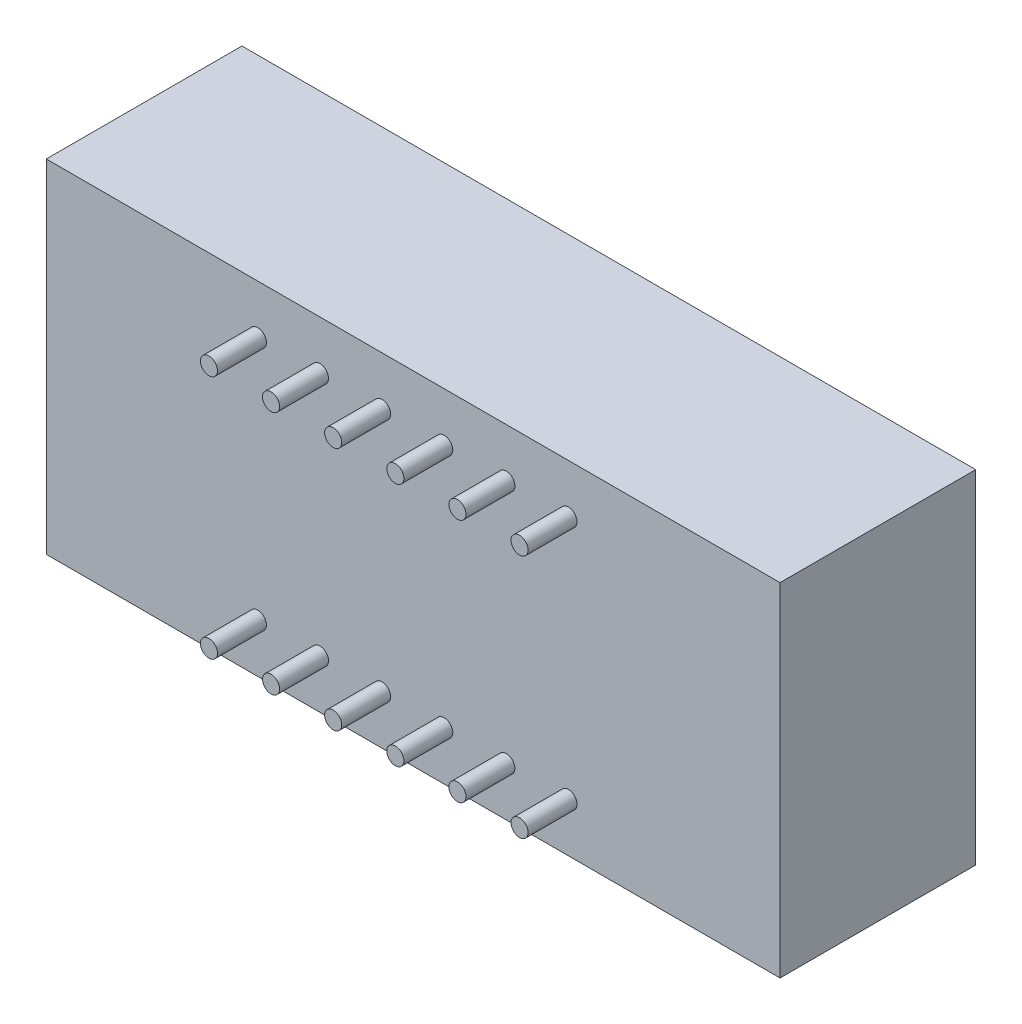
ISO-10303-21;
HEADER;
FILE_DESCRIPTION(('STEP AP214'),'2;1');
FILE_NAME('part.step','',(''),(''),'','','');
FILE_SCHEMA(('AUTOMOTIVE_DESIGN { 1 0 10303 214 1 1 1 1 }'));
ENDSEC;
DATA;
#1=APPLICATION_CONTEXT('core data for automotive mechanical design processes');
#2=APPLICATION_PROTOCOL_DEFINITION('international standard','automotive_design',2000,#1);
#3=PRODUCT_CONTEXT('',#1,'mechanical');
#4=PRODUCT('Part','Part','',(#3));
#5=PRODUCT_RELATED_PRODUCT_CATEGORY('part','',(#4));
#6=PRODUCT_DEFINITION_FORMATION('','',#4);
#7=PRODUCT_DEFINITION_CONTEXT('part definition',#1,'design');
#8=PRODUCT_DEFINITION('design','',#6,#7);
#9=PRODUCT_DEFINITION_SHAPE('','',#8);
#10=(LENGTH_UNIT() NAMED_UNIT(*) SI_UNIT(.MILLI.,.METRE.));
#11=(NAMED_UNIT(*) PLANE_ANGLE_UNIT() SI_UNIT($,.RADIAN.));
#12=(NAMED_UNIT(*) SI_UNIT($,.STERADIAN.) SOLID_ANGLE_UNIT());
#13=UNCERTAINTY_MEASURE_WITH_UNIT(LENGTH_MEASURE(1.E-05),#10,'distance_accuracy_value','');
#14=(GEOMETRIC_REPRESENTATION_CONTEXT(3) GLOBAL_UNCERTAINTY_ASSIGNED_CONTEXT((#13)) GLOBAL_UNIT_ASSIGNED_CONTEXT((#10,
#11,#12)) REPRESENTATION_CONTEXT('',''));
#15=CARTESIAN_POINT('',(0.,0.,0.));
#16=DIRECTION('',(0.,0.,1.));
#17=DIRECTION('',(1.,0.,0.));
#18=AXIS2_PLACEMENT_3D('',#15,#16,#17);
#19=CARTESIAN_POINT('',(0.,14.,8.));
#20=DIRECTION('',(0.,0.,-1.));
#21=DIRECTION('',(-1.,0.,0.));
#22=AXIS2_PLACEMENT_3D('',#19,#20,#21);
#23=PLANE('',#22);
#24=CARTESIAN_POINT('',(18.8100000000001,2.,8.));
#25=DIRECTION('',(0.,0.,-1.));
#26=DIRECTION('',(-1.,0.,0.));
#27=AXIS2_PLACEMENT_3D('',#24,#25,#26);
#28=CIRCLE('',#27,0.350000000000001);
#29=CARTESIAN_POINT('',(18.4600000000001,2.,8.));
#30=VERTEX_POINT('',#29);
#31=EDGE_CURVE('E51',#30,#30,#28,.F.);
#32=ORIENTED_EDGE('',*,*,#31,.F.);
#33=EDGE_LOOP('',(#32));
#34=FACE_BOUND('',#33,.T.);
#35=CARTESIAN_POINT('',(13.7300000000001,2.,8.));
#36=DIRECTION('',(0.,0.,-1.));
#37=DIRECTION('',(-1.,0.,0.));
#38=AXIS2_PLACEMENT_3D('',#35,#36,#37);
#39=CIRCLE('',#38,0.349999999999999);
#40=CARTESIAN_POINT('',(13.3800000000001,2.,8.));
#41=VERTEX_POINT('',#40);
#42=EDGE_CURVE('E165',#41,#41,#39,.F.);
#43=ORIENTED_EDGE('',*,*,#42,.F.);
#44=EDGE_LOOP('',(#43));
#45=FACE_BOUND('',#44,.T.);
#46=CARTESIAN_POINT('',(8.6500000000001,1.99999999999997,8.));
#47=DIRECTION('',(0.,0.,-1.));
#48=DIRECTION('',(-1.,0.,0.));
#49=AXIS2_PLACEMENT_3D('',#46,#47,#48);
#50=CIRCLE('',#49,0.349999999999999);
#51=CARTESIAN_POINT('',(8.3000000000001,1.99999999999997,8.));
#52=VERTEX_POINT('',#51);
#53=EDGE_CURVE('E157',#52,#52,#50,.F.);
#54=ORIENTED_EDGE('',*,*,#53,.F.);
#55=EDGE_LOOP('',(#54));
#56=FACE_BOUND('',#55,.T.);
#57=CARTESIAN_POINT('',(18.81,12.,8.));
#58=DIRECTION('',(0.,0.,-1.));
#59=DIRECTION('',(-1.,0.,0.));
#60=AXIS2_PLACEMENT_3D('',#57,#58,#59);
#61=CIRCLE('',#60,0.349999999999997);
#62=CARTESIAN_POINT('',(18.46,12.,8.));
#63=VERTEX_POINT('',#62);
#64=EDGE_CURVE('E149',#63,#63,#61,.F.);
#65=ORIENTED_EDGE('',*,*,#64,.F.);
#66=EDGE_LOOP('',(#65));
#67=FACE_BOUND('',#66,.T.);
#68=CARTESIAN_POINT('',(13.73,12.,8.));
#69=DIRECTION('',(0.,0.,-1.));
#70=DIRECTION('',(-1.,0.,0.));
#71=AXIS2_PLACEMENT_3D('',#68,#69,#70);
#72=CIRCLE('',#71,0.349999999999999);
#73=CARTESIAN_POINT('',(13.38,12.,8.));
#74=VERTEX_POINT('',#73);
#75=EDGE_CURVE('E141',#74,#74,#72,.F.);
#76=ORIENTED_EDGE('',*,*,#75,.F.);
#77=EDGE_LOOP('',(#76));
#78=FACE_BOUND('',#77,.T.);
#79=CARTESIAN_POINT('',(8.65,12.,8.));
#80=DIRECTION('',(0.,0.,-1.));
#81=DIRECTION('',(-1.,0.,0.));
#82=AXIS2_PLACEMENT_3D('',#79,#80,#81);
#83=CIRCLE('',#82,0.350000000000001);
#84=CARTESIAN_POINT('',(8.3,12.,8.));
#85=VERTEX_POINT('',#84);
#86=EDGE_CURVE('E133',#85,#85,#83,.F.);
#87=ORIENTED_EDGE('',*,*,#86,.F.);
#88=EDGE_LOOP('',(#87));
#89=FACE_BOUND('',#88,.T.);
#90=DIRECTION('',(0.,-1.,0.));
#91=VECTOR('',#90,1.);
#92=CARTESIAN_POINT('',(0.,0.,8.));
#93=LINE('',#92,#91);
#94=CARTESIAN_POINT('',(0.,14.,8.));
#95=VERTEX_POINT('',#94);
#96=CARTESIAN_POINT('',(0.,0.,8.));
#97=VERTEX_POINT('',#96);
#98=EDGE_CURVE('E95',#95,#97,#93,.T.);
#99=ORIENTED_EDGE('',*,*,#98,.T.);
#100=DIRECTION('',(1.,0.,0.));
#101=VECTOR('',#100,1.);
#102=CARTESIAN_POINT('',(0.,0.,8.));
#103=LINE('',#102,#101);
#104=CARTESIAN_POINT('',(30.,0.,8.));
#105=VERTEX_POINT('',#104);
#106=EDGE_CURVE('E90',#97,#105,#103,.T.);
#107=ORIENTED_EDGE('',*,*,#106,.T.);
#108=DIRECTION('',(0.,1.,0.));
#109=VECTOR('',#108,1.);
#110=CARTESIAN_POINT('',(30.,0.,8.));
#111=LINE('',#110,#109);
#112=CARTESIAN_POINT('',(30.,14.,8.));
#113=VERTEX_POINT('',#112);
#114=EDGE_CURVE('E93',#105,#113,#111,.T.);
#115=ORIENTED_EDGE('',*,*,#114,.T.);
#116=DIRECTION('',(-1.,0.,0.));
#117=VECTOR('',#116,1.);
#118=CARTESIAN_POINT('',(0.,14.,8.));
#119=LINE('',#118,#117);
#120=EDGE_CURVE('E59',#113,#95,#119,.T.);
#121=ORIENTED_EDGE('',*,*,#120,.T.);
#122=EDGE_LOOP('',(#99,#107,#115,#121));
#123=FACE_BOUND('',#122,.T.);
#124=CARTESIAN_POINT('',(11.19,12.,8.));
#125=DIRECTION('',(0.,0.,-1.));
#126=DIRECTION('',(-1.,0.,0.));
#127=AXIS2_PLACEMENT_3D('',#124,#125,#126);
#128=CIRCLE('',#127,0.349999999999999);
#129=CARTESIAN_POINT('',(10.84,12.,8.));
#130=VERTEX_POINT('',#129);
#131=EDGE_CURVE('E137',#130,#130,#128,.F.);
#132=ORIENTED_EDGE('',*,*,#131,.F.);
#133=EDGE_LOOP('',(#132));
#134=FACE_BOUND('',#133,.T.);
#135=CARTESIAN_POINT('',(16.27,12.,8.));
#136=DIRECTION('',(0.,0.,-1.));
#137=DIRECTION('',(-1.,0.,0.));
#138=AXIS2_PLACEMENT_3D('',#135,#136,#137);
#139=CIRCLE('',#138,0.349999999999997);
#140=CARTESIAN_POINT('',(15.92,12.,8.));
#141=VERTEX_POINT('',#140);
#142=EDGE_CURVE('E145',#141,#141,#139,.F.);
#143=ORIENTED_EDGE('',*,*,#142,.F.);
#144=EDGE_LOOP('',(#143));
#145=FACE_BOUND('',#144,.T.);
#146=CARTESIAN_POINT('',(21.35,12.,8.));
#147=DIRECTION('',(0.,0.,-1.));
#148=DIRECTION('',(-1.,0.,0.));
#149=AXIS2_PLACEMENT_3D('',#146,#147,#148);
#150=CIRCLE('',#149,0.349999999999997);
#151=CARTESIAN_POINT('',(21.,12.,8.));
#152=VERTEX_POINT('',#151);
#153=EDGE_CURVE('E153',#152,#152,#150,.F.);
#154=ORIENTED_EDGE('',*,*,#153,.F.);
#155=EDGE_LOOP('',(#154));
#156=FACE_BOUND('',#155,.T.);
#157=CARTESIAN_POINT('',(11.1900000000001,1.99999999999998,8.));
#158=DIRECTION('',(0.,0.,-1.));
#159=DIRECTION('',(-1.,0.,0.));
#160=AXIS2_PLACEMENT_3D('',#157,#158,#159);
#161=CIRCLE('',#160,0.349999999999999);
#162=CARTESIAN_POINT('',(10.8400000000001,1.99999999999998,8.));
#163=VERTEX_POINT('',#162);
#164=EDGE_CURVE('E161',#163,#163,#161,.F.);
#165=ORIENTED_EDGE('',*,*,#164,.F.);
#166=EDGE_LOOP('',(#165));
#167=FACE_BOUND('',#166,.T.);
#168=CARTESIAN_POINT('',(16.2700000000001,2.,8.));
#169=DIRECTION('',(0.,0.,-1.));
#170=DIRECTION('',(-1.,0.,0.));
#171=AXIS2_PLACEMENT_3D('',#168,#169,#170);
#172=CIRCLE('',#171,0.350000000000001);
#173=CARTESIAN_POINT('',(15.9200000000001,2.,8.));
#174=VERTEX_POINT('',#173);
#175=EDGE_CURVE('E168',#174,#174,#172,.F.);
#176=ORIENTED_EDGE('',*,*,#175,.F.);
#177=EDGE_LOOP('',(#176));
#178=FACE_BOUND('',#177,.T.);
#179=CARTESIAN_POINT('',(21.3500000000001,2.,8.));
#180=DIRECTION('',(0.,0.,-1.));
#181=DIRECTION('',(-1.,0.,0.));
#182=AXIS2_PLACEMENT_3D('',#179,#180,#181);
#183=CIRCLE('',#182,0.349999999999997);
#184=CARTESIAN_POINT('',(21.0000000000001,2.,8.));
#185=VERTEX_POINT('',#184);
#186=EDGE_CURVE('E11',#185,#185,#183,.F.);
#187=ORIENTED_EDGE('',*,*,#186,.F.);
#188=EDGE_LOOP('',(#187));
#189=FACE_BOUND('',#188,.T.);
#190=ADVANCED_FACE('F41',(#34,#45,#56,#67,#78,#89,#123,#134,#145,#156,#167,#178,#189),#23,.F.);
#191=CARTESIAN_POINT('',(0.,0.,8.));
#192=DIRECTION('',(1.,0.,0.));
#193=DIRECTION('',(0.,0.,-1.));
#194=AXIS2_PLACEMENT_3D('',#191,#192,#193);
#195=PLANE('',#194);
#196=DIRECTION('',(0.,-1.,0.));
#197=VECTOR('',#196,1.);
#198=CARTESIAN_POINT('',(0.,0.,0.));
#199=LINE('',#198,#197);
#200=CARTESIAN_POINT('',(0.,14.,0.));
#201=VERTEX_POINT('',#200);
#202=CARTESIAN_POINT('',(0.,0.,0.));
#203=VERTEX_POINT('',#202);
#204=EDGE_CURVE('E116',#201,#203,#199,.T.);
#205=ORIENTED_EDGE('',*,*,#204,.T.);
#206=DIRECTION('',(0.,0.,-1.));
#207=VECTOR('',#206,1.);
#208=CARTESIAN_POINT('',(0.,0.,8.));
#209=LINE('',#208,#207);
#210=EDGE_CURVE('E103',#97,#203,#209,.T.);
#211=ORIENTED_EDGE('',*,*,#210,.F.);
#212=ORIENTED_EDGE('',*,*,#98,.F.);
#213=DIRECTION('',(0.,0.,-1.));
#214=VECTOR('',#213,1.);
#215=CARTESIAN_POINT('',(0.,14.,8.));
#216=LINE('',#215,#214);
#217=EDGE_CURVE('E112',#95,#201,#216,.T.);
#218=ORIENTED_EDGE('',*,*,#217,.T.);
#219=EDGE_LOOP('',(#205,#211,#212,#218));
#220=FACE_BOUND('',#219,.T.);
#221=ADVANCED_FACE('F43',(#220),#195,.F.);
#222=CARTESIAN_POINT('',(0.,0.,8.));
#223=DIRECTION('',(0.,1.,0.));
#224=DIRECTION('',(0.,0.,1.));
#225=AXIS2_PLACEMENT_3D('',#222,#223,#224);
#226=PLANE('',#225);
#227=DIRECTION('',(1.,0.,0.));
#228=VECTOR('',#227,1.);
#229=CARTESIAN_POINT('',(0.,0.,0.));
#230=LINE('',#229,#228);
#231=CARTESIAN_POINT('',(30.,0.,0.));
#232=VERTEX_POINT('',#231);
#233=EDGE_CURVE('E101',#203,#232,#230,.T.);
#234=ORIENTED_EDGE('',*,*,#233,.T.);
#235=DIRECTION('',(0.,0.,-1.));
#236=VECTOR('',#235,1.);
#237=CARTESIAN_POINT('',(30.,0.,8.));
#238=LINE('',#237,#236);
#239=EDGE_CURVE('E99',#105,#232,#238,.T.);
#240=ORIENTED_EDGE('',*,*,#239,.F.);
#241=ORIENTED_EDGE('',*,*,#106,.F.);
#242=ORIENTED_EDGE('',*,*,#210,.T.);
#243=EDGE_LOOP('',(#234,#240,#241,#242));
#244=FACE_BOUND('',#243,.T.);
#245=ADVANCED_FACE('F100',(#244),#226,.F.);
#246=CARTESIAN_POINT('',(30.,0.,8.));
#247=DIRECTION('',(-1.,0.,0.));
#248=DIRECTION('',(0.,0.,1.));
#249=AXIS2_PLACEMENT_3D('',#246,#247,#248);
#250=PLANE('',#249);
#251=DIRECTION('',(0.,1.,0.));
#252=VECTOR('',#251,1.);
#253=CARTESIAN_POINT('',(30.,0.,0.));
#254=LINE('',#253,#252);
#255=CARTESIAN_POINT('',(30.,14.,0.));
#256=VERTEX_POINT('',#255);
#257=EDGE_CURVE('E76',#232,#256,#254,.T.);
#258=ORIENTED_EDGE('',*,*,#257,.T.);
#259=DIRECTION('',(0.,0.,-1.));
#260=VECTOR('',#259,1.);
#261=CARTESIAN_POINT('',(30.,14.,8.));
#262=LINE('',#261,#260);
#263=EDGE_CURVE('E104',#113,#256,#262,.T.);
#264=ORIENTED_EDGE('',*,*,#263,.F.);
#265=ORIENTED_EDGE('',*,*,#114,.F.);
#266=ORIENTED_EDGE('',*,*,#239,.T.);
#267=EDGE_LOOP('',(#258,#264,#265,#266));
#268=FACE_BOUND('',#267,.T.);
#269=ADVANCED_FACE('F106',(#268),#250,.F.);
#270=CARTESIAN_POINT('',(0.,14.,8.));
#271=DIRECTION('',(0.,-1.,0.));
#272=DIRECTION('',(0.,0.,-1.));
#273=AXIS2_PLACEMENT_3D('',#270,#271,#272);
#274=PLANE('',#273);
#275=DIRECTION('',(-1.,0.,0.));
#276=VECTOR('',#275,1.);
#277=CARTESIAN_POINT('',(0.,14.,0.));
#278=LINE('',#277,#276);
#279=EDGE_CURVE('E82',#256,#201,#278,.T.);
#280=ORIENTED_EDGE('',*,*,#279,.T.);
#281=ORIENTED_EDGE('',*,*,#217,.F.);
#282=ORIENTED_EDGE('',*,*,#120,.F.);
#283=ORIENTED_EDGE('',*,*,#263,.T.);
#284=EDGE_LOOP('',(#280,#281,#282,#283));
#285=FACE_BOUND('',#284,.T.);
#286=ADVANCED_FACE('F203',(#285),#274,.F.);
#287=CARTESIAN_POINT('',(0.,14.,0.));
#288=DIRECTION('',(0.,0.,-1.));
#289=DIRECTION('',(-1.,0.,0.));
#290=AXIS2_PLACEMENT_3D('',#287,#288,#289);
#291=PLANE('',#290);
#292=ORIENTED_EDGE('',*,*,#204,.F.);
#293=ORIENTED_EDGE('',*,*,#279,.F.);
#294=ORIENTED_EDGE('',*,*,#257,.F.);
#295=ORIENTED_EDGE('',*,*,#233,.F.);
#296=EDGE_LOOP('',(#292,#293,#294,#295));
#297=FACE_BOUND('',#296,.T.);
#298=ADVANCED_FACE('F193',(#297),#291,.T.);
#299=CARTESIAN_POINT('',(8.65,12.,10.));
#300=DIRECTION('',(0.,0.,-1.));
#301=DIRECTION('',(-1.,0.,0.));
#302=AXIS2_PLACEMENT_3D('',#299,#300,#301);
#303=CYLINDRICAL_SURFACE('',#302,0.350000000000001);
#304=CARTESIAN_POINT('',(8.65,12.,10.));
#305=DIRECTION('',(0.,0.,1.));
#306=DIRECTION('',(1.,0.,0.));
#307=AXIS2_PLACEMENT_3D('',#304,#305,#306);
#308=CIRCLE('',#307,0.350000000000001);
#309=CARTESIAN_POINT('',(9.,12.,10.));
#310=VERTEX_POINT('',#309);
#311=EDGE_CURVE('E120',#310,#310,#308,.T.);
#312=ORIENTED_EDGE('',*,*,#311,.F.);
#313=EDGE_LOOP('',(#312));
#314=FACE_BOUND('',#313,.T.);
#315=ORIENTED_EDGE('',*,*,#86,.T.);
#316=EDGE_LOOP('',(#315));
#317=FACE_BOUND('',#316,.T.);
#318=ADVANCED_FACE('F190',(#314,#317),#303,.T.);
#319=CARTESIAN_POINT('',(8.65,12.,10.));
#320=DIRECTION('',(0.,0.,1.));
#321=DIRECTION('',(1.,0.,0.));
#322=AXIS2_PLACEMENT_3D('',#319,#320,#321);
#323=PLANE('',#322);
#324=ORIENTED_EDGE('',*,*,#311,.T.);
#325=EDGE_LOOP('',(#324));
#326=FACE_BOUND('',#325,.T.);
#327=ADVANCED_FACE('F192',(#326),#323,.T.);
#328=CARTESIAN_POINT('',(11.19,12.,10.));
#329=DIRECTION('',(0.,0.,-1.));
#330=DIRECTION('',(-1.,0.,0.));
#331=AXIS2_PLACEMENT_3D('',#328,#329,#330);
#332=CYLINDRICAL_SURFACE('',#331,0.349999999999999);
#333=CARTESIAN_POINT('',(11.19,12.,10.));
#334=DIRECTION('',(0.,0.,1.));
#335=DIRECTION('',(1.,0.,0.));
#336=AXIS2_PLACEMENT_3D('',#333,#334,#335);
#337=CIRCLE('',#336,0.349999999999999);
#338=CARTESIAN_POINT('',(11.54,12.,10.));
#339=VERTEX_POINT('',#338);
#340=EDGE_CURVE('E225',#339,#339,#337,.T.);
#341=ORIENTED_EDGE('',*,*,#340,.F.);
#342=EDGE_LOOP('',(#341));
#343=FACE_BOUND('',#342,.T.);
#344=ORIENTED_EDGE('',*,*,#131,.T.);
#345=EDGE_LOOP('',(#344));
#346=FACE_BOUND('',#345,.T.);
#347=ADVANCED_FACE('F200',(#343,#346),#332,.T.);
#348=CARTESIAN_POINT('',(11.19,12.,10.));
#349=DIRECTION('',(0.,0.,1.));
#350=DIRECTION('',(1.,0.,0.));
#351=AXIS2_PLACEMENT_3D('',#348,#349,#350);
#352=PLANE('',#351);
#353=ORIENTED_EDGE('',*,*,#340,.T.);
#354=EDGE_LOOP('',(#353));
#355=FACE_BOUND('',#354,.T.);
#356=ADVANCED_FACE('F349',(#355),#352,.T.);
#357=CARTESIAN_POINT('',(13.73,12.,10.));
#358=DIRECTION('',(0.,0.,-1.));
#359=DIRECTION('',(-1.,0.,0.));
#360=AXIS2_PLACEMENT_3D('',#357,#358,#359);
#361=CYLINDRICAL_SURFACE('',#360,0.349999999999999);
#362=CARTESIAN_POINT('',(13.73,12.,10.));
#363=DIRECTION('',(0.,0.,1.));
#364=DIRECTION('',(1.,0.,0.));
#365=AXIS2_PLACEMENT_3D('',#362,#363,#364);
#366=CIRCLE('',#365,0.349999999999999);
#367=CARTESIAN_POINT('',(14.08,12.,10.));
#368=VERTEX_POINT('',#367);
#369=EDGE_CURVE('E229',#368,#368,#366,.T.);
#370=ORIENTED_EDGE('',*,*,#369,.F.);
#371=EDGE_LOOP('',(#370));
#372=FACE_BOUND('',#371,.T.);
#373=ORIENTED_EDGE('',*,*,#75,.T.);
#374=EDGE_LOOP('',(#373));
#375=FACE_BOUND('',#374,.T.);
#376=ADVANCED_FACE('F346',(#372,#375),#361,.T.);
#377=CARTESIAN_POINT('',(13.73,12.,10.));
#378=DIRECTION('',(0.,0.,1.));
#379=DIRECTION('',(1.,0.,0.));
#380=AXIS2_PLACEMENT_3D('',#377,#378,#379);
#381=PLANE('',#380);
#382=ORIENTED_EDGE('',*,*,#369,.T.);
#383=EDGE_LOOP('',(#382));
#384=FACE_BOUND('',#383,.T.);
#385=ADVANCED_FACE('F341',(#384),#381,.T.);
#386=CARTESIAN_POINT('',(16.27,12.,10.));
#387=DIRECTION('',(0.,0.,-1.));
#388=DIRECTION('',(-1.,0.,0.));
#389=AXIS2_PLACEMENT_3D('',#386,#387,#388);
#390=CYLINDRICAL_SURFACE('',#389,0.349999999999997);
#391=CARTESIAN_POINT('',(16.27,12.,10.));
#392=DIRECTION('',(0.,0.,1.));
#393=DIRECTION('',(1.,0.,0.));
#394=AXIS2_PLACEMENT_3D('',#391,#392,#393);
#395=CIRCLE('',#394,0.349999999999997);
#396=CARTESIAN_POINT('',(16.62,12.,10.));
#397=VERTEX_POINT('',#396);
#398=EDGE_CURVE('E233',#397,#397,#395,.T.);
#399=ORIENTED_EDGE('',*,*,#398,.F.);
#400=EDGE_LOOP('',(#399));
#401=FACE_BOUND('',#400,.T.);
#402=ORIENTED_EDGE('',*,*,#142,.T.);
#403=EDGE_LOOP('',(#402));
#404=FACE_BOUND('',#403,.T.);
#405=ADVANCED_FACE('F338',(#401,#404),#390,.T.);
#406=CARTESIAN_POINT('',(16.27,12.,10.));
#407=DIRECTION('',(0.,0.,1.));
#408=DIRECTION('',(1.,0.,0.));
#409=AXIS2_PLACEMENT_3D('',#406,#407,#408);
#410=PLANE('',#409);
#411=ORIENTED_EDGE('',*,*,#398,.T.);
#412=EDGE_LOOP('',(#411));
#413=FACE_BOUND('',#412,.T.);
#414=ADVANCED_FACE('F333',(#413),#410,.T.);
#415=CARTESIAN_POINT('',(18.81,12.,10.));
#416=DIRECTION('',(0.,0.,-1.));
#417=DIRECTION('',(-1.,0.,0.));
#418=AXIS2_PLACEMENT_3D('',#415,#416,#417);
#419=CYLINDRICAL_SURFACE('',#418,0.349999999999997);
#420=CARTESIAN_POINT('',(18.81,12.,10.));
#421=DIRECTION('',(0.,0.,1.));
#422=DIRECTION('',(1.,0.,0.));
#423=AXIS2_PLACEMENT_3D('',#420,#421,#422);
#424=CIRCLE('',#423,0.349999999999997);
#425=CARTESIAN_POINT('',(19.16,12.,10.));
#426=VERTEX_POINT('',#425);
#427=EDGE_CURVE('E237',#426,#426,#424,.T.);
#428=ORIENTED_EDGE('',*,*,#427,.F.);
#429=EDGE_LOOP('',(#428));
#430=FACE_BOUND('',#429,.T.);
#431=ORIENTED_EDGE('',*,*,#64,.T.);
#432=EDGE_LOOP('',(#431));
#433=FACE_BOUND('',#432,.T.);
#434=ADVANCED_FACE('F330',(#430,#433),#419,.T.);
#435=CARTESIAN_POINT('',(18.81,12.,10.));
#436=DIRECTION('',(0.,0.,1.));
#437=DIRECTION('',(1.,0.,0.));
#438=AXIS2_PLACEMENT_3D('',#435,#436,#437);
#439=PLANE('',#438);
#440=ORIENTED_EDGE('',*,*,#427,.T.);
#441=EDGE_LOOP('',(#440));
#442=FACE_BOUND('',#441,.T.);
#443=ADVANCED_FACE('F325',(#442),#439,.T.);
#444=CARTESIAN_POINT('',(21.35,12.,10.));
#445=DIRECTION('',(0.,0.,-1.));
#446=DIRECTION('',(-1.,0.,0.));
#447=AXIS2_PLACEMENT_3D('',#444,#445,#446);
#448=CYLINDRICAL_SURFACE('',#447,0.349999999999997);
#449=CARTESIAN_POINT('',(21.35,12.,10.));
#450=DIRECTION('',(0.,0.,1.));
#451=DIRECTION('',(1.,0.,0.));
#452=AXIS2_PLACEMENT_3D('',#449,#450,#451);
#453=CIRCLE('',#452,0.349999999999997);
#454=CARTESIAN_POINT('',(21.7,12.,10.));
#455=VERTEX_POINT('',#454);
#456=EDGE_CURVE('E241',#455,#455,#453,.T.);
#457=ORIENTED_EDGE('',*,*,#456,.F.);
#458=EDGE_LOOP('',(#457));
#459=FACE_BOUND('',#458,.T.);
#460=ORIENTED_EDGE('',*,*,#153,.T.);
#461=EDGE_LOOP('',(#460));
#462=FACE_BOUND('',#461,.T.);
#463=ADVANCED_FACE('F322',(#459,#462),#448,.T.);
#464=CARTESIAN_POINT('',(21.35,12.,10.));
#465=DIRECTION('',(0.,0.,1.));
#466=DIRECTION('',(1.,0.,0.));
#467=AXIS2_PLACEMENT_3D('',#464,#465,#466);
#468=PLANE('',#467);
#469=ORIENTED_EDGE('',*,*,#456,.T.);
#470=EDGE_LOOP('',(#469));
#471=FACE_BOUND('',#470,.T.);
#472=ADVANCED_FACE('F317',(#471),#468,.T.);
#473=CARTESIAN_POINT('',(8.6500000000001,1.99999999999997,10.));
#474=DIRECTION('',(0.,0.,-1.));
#475=DIRECTION('',(-1.,0.,0.));
#476=AXIS2_PLACEMENT_3D('',#473,#474,#475);
#477=CYLINDRICAL_SURFACE('',#476,0.349999999999999);
#478=CARTESIAN_POINT('',(8.6500000000001,1.99999999999997,10.));
#479=DIRECTION('',(0.,0.,1.));
#480=DIRECTION('',(1.,0.,0.));
#481=AXIS2_PLACEMENT_3D('',#478,#479,#480);
#482=CIRCLE('',#481,0.349999999999999);
#483=CARTESIAN_POINT('',(9.0000000000001,1.99999999999997,10.));
#484=VERTEX_POINT('',#483);
#485=EDGE_CURVE('E245',#484,#484,#482,.T.);
#486=ORIENTED_EDGE('',*,*,#485,.F.);
#487=EDGE_LOOP('',(#486));
#488=FACE_BOUND('',#487,.T.);
#489=ORIENTED_EDGE('',*,*,#53,.T.);
#490=EDGE_LOOP('',(#489));
#491=FACE_BOUND('',#490,.T.);
#492=ADVANCED_FACE('F314',(#488,#491),#477,.T.);
#493=CARTESIAN_POINT('',(8.6500000000001,1.99999999999997,10.));
#494=DIRECTION('',(0.,0.,1.));
#495=DIRECTION('',(1.,0.,0.));
#496=AXIS2_PLACEMENT_3D('',#493,#494,#495);
#497=PLANE('',#496);
#498=ORIENTED_EDGE('',*,*,#485,.T.);
#499=EDGE_LOOP('',(#498));
#500=FACE_BOUND('',#499,.T.);
#501=ADVANCED_FACE('F309',(#500),#497,.T.);
#502=CARTESIAN_POINT('',(11.1900000000001,1.99999999999998,10.));
#503=DIRECTION('',(0.,0.,-1.));
#504=DIRECTION('',(-1.,0.,0.));
#505=AXIS2_PLACEMENT_3D('',#502,#503,#504);
#506=CYLINDRICAL_SURFACE('',#505,0.349999999999999);
#507=CARTESIAN_POINT('',(11.1900000000001,1.99999999999998,10.));
#508=DIRECTION('',(0.,0.,1.));
#509=DIRECTION('',(1.,0.,0.));
#510=AXIS2_PLACEMENT_3D('',#507,#508,#509);
#511=CIRCLE('',#510,0.349999999999999);
#512=CARTESIAN_POINT('',(11.5400000000001,1.99999999999998,10.));
#513=VERTEX_POINT('',#512);
#514=EDGE_CURVE('E248',#513,#513,#511,.T.);
#515=ORIENTED_EDGE('',*,*,#514,.F.);
#516=EDGE_LOOP('',(#515));
#517=FACE_BOUND('',#516,.T.);
#518=ORIENTED_EDGE('',*,*,#164,.T.);
#519=EDGE_LOOP('',(#518));
#520=FACE_BOUND('',#519,.T.);
#521=ADVANCED_FACE('F306',(#517,#520),#506,.T.);
#522=CARTESIAN_POINT('',(11.1900000000001,1.99999999999998,10.));
#523=DIRECTION('',(0.,0.,1.));
#524=DIRECTION('',(1.,0.,0.));
#525=AXIS2_PLACEMENT_3D('',#522,#523,#524);
#526=PLANE('',#525);
#527=ORIENTED_EDGE('',*,*,#514,.T.);
#528=EDGE_LOOP('',(#527));
#529=FACE_BOUND('',#528,.T.);
#530=ADVANCED_FACE('F301',(#529),#526,.T.);
#531=CARTESIAN_POINT('',(13.7300000000001,2.,10.));
#532=DIRECTION('',(0.,0.,-1.));
#533=DIRECTION('',(-1.,0.,0.));
#534=AXIS2_PLACEMENT_3D('',#531,#532,#533);
#535=CYLINDRICAL_SURFACE('',#534,0.349999999999999);
#536=CARTESIAN_POINT('',(13.7300000000001,2.,10.));
#537=DIRECTION('',(0.,0.,1.));
#538=DIRECTION('',(1.,0.,0.));
#539=AXIS2_PLACEMENT_3D('',#536,#537,#538);
#540=CIRCLE('',#539,0.349999999999999);
#541=CARTESIAN_POINT('',(14.0800000000001,2.,10.));
#542=VERTEX_POINT('',#541);
#543=EDGE_CURVE('E252',#542,#542,#540,.T.);
#544=ORIENTED_EDGE('',*,*,#543,.F.);
#545=EDGE_LOOP('',(#544));
#546=FACE_BOUND('',#545,.T.);
#547=ORIENTED_EDGE('',*,*,#42,.T.);
#548=EDGE_LOOP('',(#547));
#549=FACE_BOUND('',#548,.T.);
#550=ADVANCED_FACE('F298',(#546,#549),#535,.T.);
#551=CARTESIAN_POINT('',(13.7300000000001,2.,10.));
#552=DIRECTION('',(0.,0.,1.));
#553=DIRECTION('',(1.,0.,0.));
#554=AXIS2_PLACEMENT_3D('',#551,#552,#553);
#555=PLANE('',#554);
#556=ORIENTED_EDGE('',*,*,#543,.T.);
#557=EDGE_LOOP('',(#556));
#558=FACE_BOUND('',#557,.T.);
#559=ADVANCED_FACE('F293',(#558),#555,.T.);
#560=CARTESIAN_POINT('',(16.2700000000001,2.,10.));
#561=DIRECTION('',(0.,0.,-1.));
#562=DIRECTION('',(-1.,0.,0.));
#563=AXIS2_PLACEMENT_3D('',#560,#561,#562);
#564=CYLINDRICAL_SURFACE('',#563,0.350000000000001);
#565=CARTESIAN_POINT('',(16.2700000000001,2.,10.));
#566=DIRECTION('',(0.,0.,1.));
#567=DIRECTION('',(1.,0.,0.));
#568=AXIS2_PLACEMENT_3D('',#565,#566,#567);
#569=CIRCLE('',#568,0.350000000000001);
#570=CARTESIAN_POINT('',(16.6200000000001,2.,10.));
#571=VERTEX_POINT('',#570);
#572=EDGE_CURVE('E256',#571,#571,#569,.T.);
#573=ORIENTED_EDGE('',*,*,#572,.F.);
#574=EDGE_LOOP('',(#573));
#575=FACE_BOUND('',#574,.T.);
#576=ORIENTED_EDGE('',*,*,#175,.T.);
#577=EDGE_LOOP('',(#576));
#578=FACE_BOUND('',#577,.T.);
#579=ADVANCED_FACE('F290',(#575,#578),#564,.T.);
#580=CARTESIAN_POINT('',(16.2700000000001,2.,10.));
#581=DIRECTION('',(0.,0.,1.));
#582=DIRECTION('',(1.,0.,0.));
#583=AXIS2_PLACEMENT_3D('',#580,#581,#582);
#584=PLANE('',#583);
#585=ORIENTED_EDGE('',*,*,#572,.T.);
#586=EDGE_LOOP('',(#585));
#587=FACE_BOUND('',#586,.T.);
#588=ADVANCED_FACE('F287',(#587),#584,.T.);
#589=CARTESIAN_POINT('',(18.8100000000001,2.,10.));
#590=DIRECTION('',(0.,0.,-1.));
#591=DIRECTION('',(-1.,0.,0.));
#592=AXIS2_PLACEMENT_3D('',#589,#590,#591);
#593=CYLINDRICAL_SURFACE('',#592,0.350000000000001);
#594=CARTESIAN_POINT('',(18.8100000000001,2.,10.));
#595=DIRECTION('',(0.,0.,1.));
#596=DIRECTION('',(1.,0.,0.));
#597=AXIS2_PLACEMENT_3D('',#594,#595,#596);
#598=CIRCLE('',#597,0.350000000000001);
#599=CARTESIAN_POINT('',(19.1600000000001,2.,10.));
#600=VERTEX_POINT('',#599);
#601=EDGE_CURVE('E260',#600,#600,#598,.T.);
#602=ORIENTED_EDGE('',*,*,#601,.F.);
#603=EDGE_LOOP('',(#602));
#604=FACE_BOUND('',#603,.T.);
#605=ORIENTED_EDGE('',*,*,#31,.T.);
#606=EDGE_LOOP('',(#605));
#607=FACE_BOUND('',#606,.T.);
#608=ADVANCED_FACE('F175',(#604,#607),#593,.T.);
#609=CARTESIAN_POINT('',(18.8100000000001,2.,10.));
#610=DIRECTION('',(0.,0.,1.));
#611=DIRECTION('',(1.,0.,0.));
#612=AXIS2_PLACEMENT_3D('',#609,#610,#611);
#613=PLANE('',#612);
#614=ORIENTED_EDGE('',*,*,#601,.T.);
#615=EDGE_LOOP('',(#614));
#616=FACE_BOUND('',#615,.T.);
#617=ADVANCED_FACE('F274',(#616),#613,.T.);
#618=CARTESIAN_POINT('',(21.3500000000001,2.,10.));
#619=DIRECTION('',(0.,0.,-1.));
#620=DIRECTION('',(-1.,0.,0.));
#621=AXIS2_PLACEMENT_3D('',#618,#619,#620);
#622=CYLINDRICAL_SURFACE('',#621,0.349999999999997);
#623=CARTESIAN_POINT('',(21.3500000000001,2.,10.));
#624=DIRECTION('',(0.,0.,1.));
#625=DIRECTION('',(1.,0.,0.));
#626=AXIS2_PLACEMENT_3D('',#623,#624,#625);
#627=CIRCLE('',#626,0.349999999999997);
#628=CARTESIAN_POINT('',(21.7000000000001,2.,10.));
#629=VERTEX_POINT('',#628);
#630=EDGE_CURVE('E264',#629,#629,#627,.T.);
#631=ORIENTED_EDGE('',*,*,#630,.F.);
#632=EDGE_LOOP('',(#631));
#633=FACE_BOUND('',#632,.T.);
#634=ORIENTED_EDGE('',*,*,#186,.T.);
#635=EDGE_LOOP('',(#634));
#636=FACE_BOUND('',#635,.T.);
#637=ADVANCED_FACE('F271',(#633,#636),#622,.T.);
#638=CARTESIAN_POINT('',(21.3500000000001,2.,10.));
#639=DIRECTION('',(0.,0.,1.));
#640=DIRECTION('',(1.,0.,0.));
#641=AXIS2_PLACEMENT_3D('',#638,#639,#640);
#642=PLANE('',#641);
#643=ORIENTED_EDGE('',*,*,#630,.T.);
#644=EDGE_LOOP('',(#643));
#645=FACE_BOUND('',#644,.T.);
#646=ADVANCED_FACE('F269',(#645),#642,.T.);
#647=CLOSED_SHELL('',(#190,#221,#245,#269,#286,#298,#318,#327,#347,#356,#376,#385,#405,#414,
#434,#443,#463,#472,#492,#501,#521,#530,#550,#559,#579,#588,#608,#617,#637,#646));
#648=MANIFOLD_SOLID_BREP('B2',#647);
#649=ADVANCED_BREP_SHAPE_REPRESENTATION('',(#18,#648),#14);
#650=SHAPE_DEFINITION_REPRESENTATION(#9,#649);
ENDSEC;
END-ISO-10303-21;
